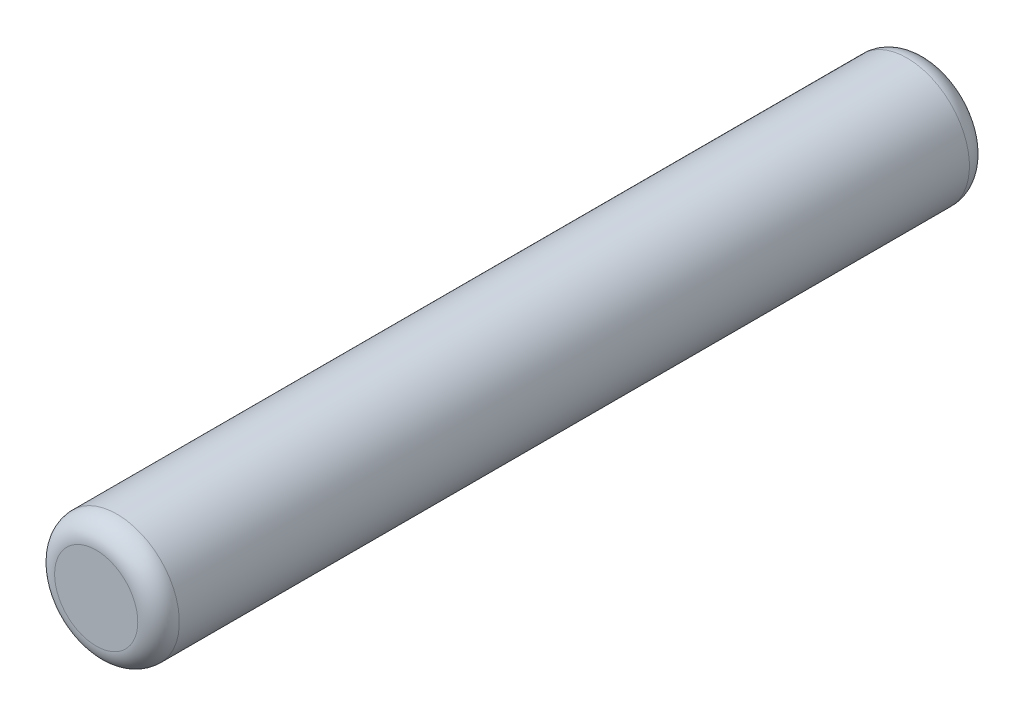
ISO-10303-21;
HEADER;
FILE_DESCRIPTION(('STEP AP214'),'2;1');
FILE_NAME('part.step','',(''),(''),'','','');
FILE_SCHEMA(('AUTOMOTIVE_DESIGN { 1 0 10303 214 1 1 1 1 }'));
ENDSEC;
DATA;
#1=APPLICATION_CONTEXT('core data for automotive mechanical design processes');
#2=APPLICATION_PROTOCOL_DEFINITION('international standard','automotive_design',2000,#1);
#3=PRODUCT_CONTEXT('',#1,'mechanical');
#4=PRODUCT('Part','Part','',(#3));
#5=PRODUCT_RELATED_PRODUCT_CATEGORY('part','',(#4));
#6=PRODUCT_DEFINITION_FORMATION('','',#4);
#7=PRODUCT_DEFINITION_CONTEXT('part definition',#1,'design');
#8=PRODUCT_DEFINITION('design','',#6,#7);
#9=PRODUCT_DEFINITION_SHAPE('','',#8);
#10=(LENGTH_UNIT() NAMED_UNIT(*) SI_UNIT(.MILLI.,.METRE.));
#11=(NAMED_UNIT(*) PLANE_ANGLE_UNIT() SI_UNIT($,.RADIAN.));
#12=(NAMED_UNIT(*) SI_UNIT($,.STERADIAN.) SOLID_ANGLE_UNIT());
#13=UNCERTAINTY_MEASURE_WITH_UNIT(LENGTH_MEASURE(1.E-05),#10,'distance_accuracy_value','');
#14=(GEOMETRIC_REPRESENTATION_CONTEXT(3) GLOBAL_UNCERTAINTY_ASSIGNED_CONTEXT((#13)) GLOBAL_UNIT_ASSIGNED_CONTEXT((#10,
#11,#12)) REPRESENTATION_CONTEXT('',''));
#15=CARTESIAN_POINT('',(0.,0.,0.));
#16=DIRECTION('',(0.,0.,1.));
#17=DIRECTION('',(1.,0.,0.));
#18=AXIS2_PLACEMENT_3D('',#15,#16,#17);
#19=CARTESIAN_POINT('',(0.,0.,10.));
#20=DIRECTION('',(0.,0.,1.));
#21=DIRECTION('',(1.,0.,0.));
#22=AXIS2_PLACEMENT_3D('',#19,#20,#21);
#23=PLANE('',#22);
#24=CARTESIAN_POINT('',(0.,0.,10.));
#25=DIRECTION('',(0.,0.,-1.));
#26=DIRECTION('',(-1.,0.,0.));
#27=AXIS2_PLACEMENT_3D('',#24,#25,#26);
#28=CIRCLE('',#27,0.5);
#29=CARTESIAN_POINT('',(-0.5,0.,10.));
#30=VERTEX_POINT('',#29);
#31=CARTESIAN_POINT('',(0.5,0.,10.));
#32=VERTEX_POINT('',#31);
#33=EDGE_CURVE('E49',#30,#32,#28,.T.);
#34=ORIENTED_EDGE('',*,*,#33,.F.);
#35=CARTESIAN_POINT('',(0.,0.,10.));
#36=DIRECTION('',(0.,0.,-1.));
#37=DIRECTION('',(1.,0.,0.));
#38=AXIS2_PLACEMENT_3D('',#35,#36,#37);
#39=CIRCLE('',#38,0.5);
#40=EDGE_CURVE('E45',#32,#30,#39,.T.);
#41=ORIENTED_EDGE('',*,*,#40,.F.);
#42=EDGE_LOOP('',(#34,#41));
#43=FACE_BOUND('',#42,.T.);
#44=ADVANCED_FACE('F16',(#43),#23,.T.);
#45=CARTESIAN_POINT('',(0.,0.,0.));
#46=DIRECTION('',(0.,0.,1.));
#47=DIRECTION('',(1.,0.,0.));
#48=AXIS2_PLACEMENT_3D('',#45,#46,#47);
#49=PLANE('',#48);
#50=CARTESIAN_POINT('',(0.,0.,0.));
#51=DIRECTION('',(0.,0.,1.));
#52=DIRECTION('',(1.,0.,0.));
#53=AXIS2_PLACEMENT_3D('',#50,#51,#52);
#54=CIRCLE('',#53,0.5);
#55=CARTESIAN_POINT('',(0.5,0.,0.));
#56=VERTEX_POINT('',#55);
#57=CARTESIAN_POINT('',(-0.5,0.,0.));
#58=VERTEX_POINT('',#57);
#59=EDGE_CURVE('E56',#56,#58,#54,.T.);
#60=ORIENTED_EDGE('',*,*,#59,.F.);
#61=CARTESIAN_POINT('',(0.,0.,0.));
#62=DIRECTION('',(0.,0.,1.));
#63=DIRECTION('',(-1.,0.,0.));
#64=AXIS2_PLACEMENT_3D('',#61,#62,#63);
#65=CIRCLE('',#64,0.5);
#66=EDGE_CURVE('E36',#58,#56,#65,.T.);
#67=ORIENTED_EDGE('',*,*,#66,.F.);
#68=EDGE_LOOP('',(#60,#67));
#69=FACE_BOUND('',#68,.T.);
#70=ADVANCED_FACE('F74',(#69),#49,.F.);
#71=CARTESIAN_POINT('',(0.,0.,9.75));
#72=DIRECTION('',(0.,0.,1.));
#73=DIRECTION('',(1.,0.,0.));
#74=AXIS2_PLACEMENT_3D('',#71,#72,#73);
#75=TOROIDAL_SURFACE('',#74,0.5,0.25);
#76=ORIENTED_EDGE('',*,*,#40,.T.);
#77=ORIENTED_EDGE('',*,*,#33,.T.);
#78=EDGE_LOOP('',(#76,#77));
#79=FACE_BOUND('',#78,.T.);
#80=CARTESIAN_POINT('',(0.,0.,9.75));
#81=DIRECTION('',(0.,0.,-1.));
#82=DIRECTION('',(-1.,0.,0.));
#83=AXIS2_PLACEMENT_3D('',#80,#81,#82);
#84=CIRCLE('',#83,0.75);
#85=CARTESIAN_POINT('',(-0.75,0.,9.75));
#86=VERTEX_POINT('',#85);
#87=EDGE_CURVE('E28',#86,#86,#84,.T.);
#88=ORIENTED_EDGE('',*,*,#87,.F.);
#89=EDGE_LOOP('',(#88));
#90=FACE_BOUND('',#89,.T.);
#91=ADVANCED_FACE('F54',(#79,#90),#75,.T.);
#92=CARTESIAN_POINT('',(0.,0.,0.25));
#93=DIRECTION('',(0.,0.,1.));
#94=DIRECTION('',(1.,0.,0.));
#95=AXIS2_PLACEMENT_3D('',#92,#93,#94);
#96=TOROIDAL_SURFACE('',#95,0.5,0.25);
#97=CARTESIAN_POINT('',(0.,0.,0.25));
#98=DIRECTION('',(0.,0.,-1.));
#99=DIRECTION('',(-1.,0.,0.));
#100=AXIS2_PLACEMENT_3D('',#97,#98,#99);
#101=CIRCLE('',#100,0.75);
#102=CARTESIAN_POINT('',(-0.75,0.,0.25));
#103=VERTEX_POINT('',#102);
#104=EDGE_CURVE('E11',#103,#103,#101,.F.);
#105=ORIENTED_EDGE('',*,*,#104,.F.);
#106=EDGE_LOOP('',(#105));
#107=FACE_BOUND('',#106,.T.);
#108=ORIENTED_EDGE('',*,*,#59,.T.);
#109=ORIENTED_EDGE('',*,*,#66,.T.);
#110=EDGE_LOOP('',(#108,#109));
#111=FACE_BOUND('',#110,.T.);
#112=ADVANCED_FACE('F73',(#107,#111),#96,.T.);
#113=CARTESIAN_POINT('',(0.,0.,10.));
#114=DIRECTION('',(0.,0.,-1.));
#115=DIRECTION('',(-1.,0.,0.));
#116=AXIS2_PLACEMENT_3D('',#113,#114,#115);
#117=CYLINDRICAL_SURFACE('',#116,0.75);
#118=ORIENTED_EDGE('',*,*,#104,.T.);
#119=EDGE_LOOP('',(#118));
#120=FACE_BOUND('',#119,.T.);
#121=ORIENTED_EDGE('',*,*,#87,.T.);
#122=EDGE_LOOP('',(#121));
#123=FACE_BOUND('',#122,.T.);
#124=ADVANCED_FACE('F119',(#120,#123),#117,.T.);
#125=CLOSED_SHELL('',(#44,#70,#91,#112,#124));
#126=MANIFOLD_SOLID_BREP('B1',#125);
#127=ADVANCED_BREP_SHAPE_REPRESENTATION('',(#18,#126),#14);
#128=SHAPE_DEFINITION_REPRESENTATION(#9,#127);
ENDSEC;
END-ISO-10303-21;
